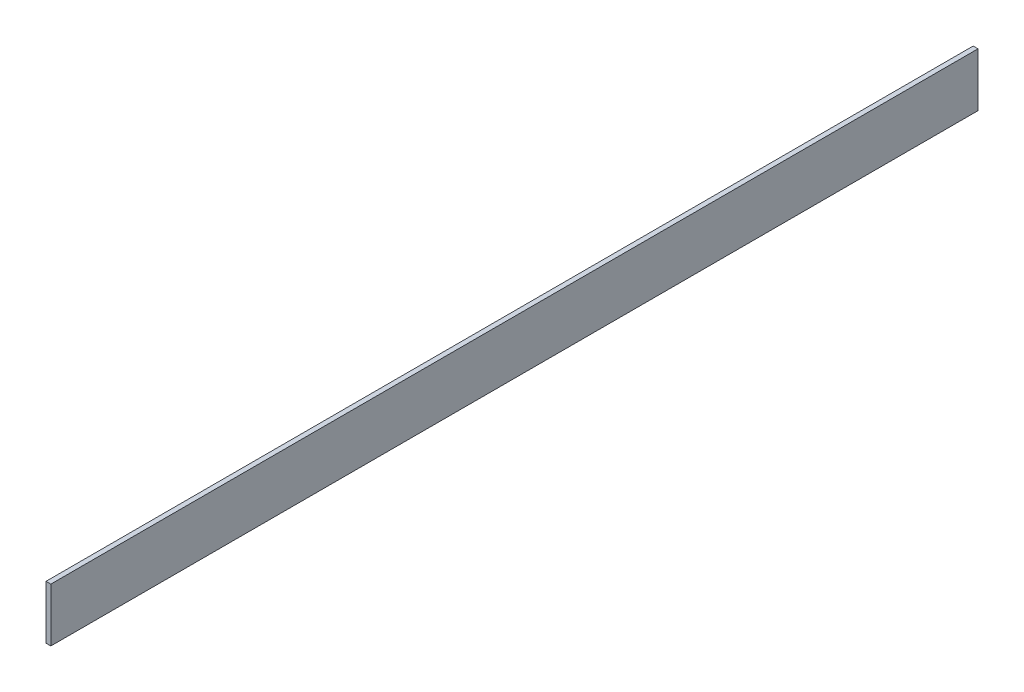
ISO-10303-21;
HEADER;
FILE_DESCRIPTION(('STEP AP214'),'2;1');
FILE_NAME('part.step','',(''),(''),'','','');
FILE_SCHEMA(('AUTOMOTIVE_DESIGN { 1 0 10303 214 1 1 1 1 }'));
ENDSEC;
DATA;
#1=APPLICATION_CONTEXT('core data for automotive mechanical design processes');
#2=APPLICATION_PROTOCOL_DEFINITION('international standard','automotive_design',2000,#1);
#3=PRODUCT_CONTEXT('',#1,'mechanical');
#4=PRODUCT('Part','Part','',(#3));
#5=PRODUCT_RELATED_PRODUCT_CATEGORY('part','',(#4));
#6=PRODUCT_DEFINITION_FORMATION('','',#4);
#7=PRODUCT_DEFINITION_CONTEXT('part definition',#1,'design');
#8=PRODUCT_DEFINITION('design','',#6,#7);
#9=PRODUCT_DEFINITION_SHAPE('','',#8);
#10=(LENGTH_UNIT() NAMED_UNIT(*) SI_UNIT(.MILLI.,.METRE.));
#11=(NAMED_UNIT(*) PLANE_ANGLE_UNIT() SI_UNIT($,.RADIAN.));
#12=(NAMED_UNIT(*) SI_UNIT($,.STERADIAN.) SOLID_ANGLE_UNIT());
#13=UNCERTAINTY_MEASURE_WITH_UNIT(LENGTH_MEASURE(1.E-05),#10,'distance_accuracy_value','');
#14=(GEOMETRIC_REPRESENTATION_CONTEXT(3) GLOBAL_UNCERTAINTY_ASSIGNED_CONTEXT((#13)) GLOBAL_UNIT_ASSIGNED_CONTEXT((#10,
#11,#12)) REPRESENTATION_CONTEXT('',''));
#15=CARTESIAN_POINT('',(0.,0.,0.));
#16=DIRECTION('',(0.,0.,1.));
#17=DIRECTION('',(1.,0.,0.));
#18=AXIS2_PLACEMENT_3D('',#15,#16,#17);
#19=CARTESIAN_POINT('',(6.35,0.,609.6));
#20=DIRECTION('',(0.,0.,-1.));
#21=DIRECTION('',(-1.,0.,0.));
#22=AXIS2_PLACEMENT_3D('',#19,#20,#21);
#23=PLANE('',#22);
#24=DIRECTION('',(0.,-1.,0.));
#25=VECTOR('',#24,1.);
#26=CARTESIAN_POINT('',(0.,0.,609.6));
#27=LINE('',#26,#25);
#28=CARTESIAN_POINT('',(0.,70.485,609.6));
#29=VERTEX_POINT('',#28);
#30=CARTESIAN_POINT('',(0.,0.,609.6));
#31=VERTEX_POINT('',#30);
#32=EDGE_CURVE('E97',#29,#31,#27,.T.);
#33=ORIENTED_EDGE('',*,*,#32,.T.);
#34=DIRECTION('',(-1.,0.,0.));
#35=VECTOR('',#34,1.);
#36=CARTESIAN_POINT('',(6.35,0.,609.6));
#37=LINE('',#36,#35);
#38=CARTESIAN_POINT('',(6.35,0.,609.6));
#39=VERTEX_POINT('',#38);
#40=EDGE_CURVE('E11',#39,#31,#37,.T.);
#41=ORIENTED_EDGE('',*,*,#40,.F.);
#42=DIRECTION('',(0.,-1.,0.));
#43=VECTOR('',#42,1.);
#44=CARTESIAN_POINT('',(6.35,0.,609.6));
#45=LINE('',#44,#43);
#46=CARTESIAN_POINT('',(6.35,70.485,609.6));
#47=VERTEX_POINT('',#46);
#48=EDGE_CURVE('E85',#47,#39,#45,.T.);
#49=ORIENTED_EDGE('',*,*,#48,.F.);
#50=DIRECTION('',(-1.,0.,0.));
#51=VECTOR('',#50,1.);
#52=CARTESIAN_POINT('',(6.35,70.485,609.6));
#53=LINE('',#52,#51);
#54=EDGE_CURVE('E93',#47,#29,#53,.T.);
#55=ORIENTED_EDGE('',*,*,#54,.T.);
#56=EDGE_LOOP('',(#33,#41,#49,#55));
#57=FACE_BOUND('',#56,.T.);
#58=ADVANCED_FACE('F34',(#57),#23,.F.);
#59=CARTESIAN_POINT('',(6.35,0.,609.6));
#60=DIRECTION('',(0.,1.,0.));
#61=DIRECTION('',(0.,0.,1.));
#62=AXIS2_PLACEMENT_3D('',#59,#60,#61);
#63=PLANE('',#62);
#64=DIRECTION('',(0.,0.,-1.));
#65=VECTOR('',#64,1.);
#66=CARTESIAN_POINT('',(0.,0.,609.6));
#67=LINE('',#66,#65);
#68=CARTESIAN_POINT('',(0.,0.,-609.6));
#69=VERTEX_POINT('',#68);
#70=EDGE_CURVE('E89',#31,#69,#67,.T.);
#71=ORIENTED_EDGE('',*,*,#70,.T.);
#72=DIRECTION('',(-1.,0.,0.));
#73=VECTOR('',#72,1.);
#74=CARTESIAN_POINT('',(6.35,0.,-609.6));
#75=LINE('',#74,#73);
#76=CARTESIAN_POINT('',(6.35,0.,-609.6));
#77=VERTEX_POINT('',#76);
#78=EDGE_CURVE('E42',#77,#69,#75,.T.);
#79=ORIENTED_EDGE('',*,*,#78,.F.);
#80=DIRECTION('',(0.,0.,-1.));
#81=VECTOR('',#80,1.);
#82=CARTESIAN_POINT('',(6.35,0.,609.6));
#83=LINE('',#82,#81);
#84=EDGE_CURVE('E80',#39,#77,#83,.T.);
#85=ORIENTED_EDGE('',*,*,#84,.F.);
#86=ORIENTED_EDGE('',*,*,#40,.T.);
#87=EDGE_LOOP('',(#71,#79,#85,#86));
#88=FACE_BOUND('',#87,.T.);
#89=ADVANCED_FACE('F88',(#88),#63,.F.);
#90=CARTESIAN_POINT('',(6.35,0.,-609.6));
#91=DIRECTION('',(0.,0.,1.));
#92=DIRECTION('',(1.,0.,0.));
#93=AXIS2_PLACEMENT_3D('',#90,#91,#92);
#94=PLANE('',#93);
#95=DIRECTION('',(0.,1.,0.));
#96=VECTOR('',#95,1.);
#97=CARTESIAN_POINT('',(0.,0.,-609.6));
#98=LINE('',#97,#96);
#99=CARTESIAN_POINT('',(0.,70.485,-609.6));
#100=VERTEX_POINT('',#99);
#101=EDGE_CURVE('E67',#69,#100,#98,.T.);
#102=ORIENTED_EDGE('',*,*,#101,.T.);
#103=DIRECTION('',(-1.,0.,0.));
#104=VECTOR('',#103,1.);
#105=CARTESIAN_POINT('',(6.35,70.485,-609.6));
#106=LINE('',#105,#104);
#107=CARTESIAN_POINT('',(6.35,70.485,-609.6));
#108=VERTEX_POINT('',#107);
#109=EDGE_CURVE('E90',#108,#100,#106,.T.);
#110=ORIENTED_EDGE('',*,*,#109,.F.);
#111=DIRECTION('',(0.,1.,0.));
#112=VECTOR('',#111,1.);
#113=CARTESIAN_POINT('',(6.35,0.,-609.6));
#114=LINE('',#113,#112);
#115=EDGE_CURVE('E83',#77,#108,#114,.T.);
#116=ORIENTED_EDGE('',*,*,#115,.F.);
#117=ORIENTED_EDGE('',*,*,#78,.T.);
#118=EDGE_LOOP('',(#102,#110,#116,#117));
#119=FACE_BOUND('',#118,.T.);
#120=ADVANCED_FACE('F91',(#119),#94,.F.);
#121=CARTESIAN_POINT('',(6.35,70.485,609.6));
#122=DIRECTION('',(0.,-1.,0.));
#123=DIRECTION('',(0.,0.,-1.));
#124=AXIS2_PLACEMENT_3D('',#121,#122,#123);
#125=PLANE('',#124);
#126=DIRECTION('',(0.,0.,1.));
#127=VECTOR('',#126,1.);
#128=CARTESIAN_POINT('',(0.,70.485,609.6));
#129=LINE('',#128,#127);
#130=EDGE_CURVE('E73',#100,#29,#129,.T.);
#131=ORIENTED_EDGE('',*,*,#130,.T.);
#132=ORIENTED_EDGE('',*,*,#54,.F.);
#133=DIRECTION('',(0.,0.,1.));
#134=VECTOR('',#133,1.);
#135=CARTESIAN_POINT('',(6.35,70.485,609.6));
#136=LINE('',#135,#134);
#137=EDGE_CURVE('E50',#108,#47,#136,.T.);
#138=ORIENTED_EDGE('',*,*,#137,.F.);
#139=ORIENTED_EDGE('',*,*,#109,.T.);
#140=EDGE_LOOP('',(#131,#132,#138,#139));
#141=FACE_BOUND('',#140,.T.);
#142=ADVANCED_FACE('F104',(#141),#125,.F.);
#143=CARTESIAN_POINT('',(6.35,0.,0.));
#144=DIRECTION('',(-1.,0.,0.));
#145=DIRECTION('',(0.,0.,1.));
#146=AXIS2_PLACEMENT_3D('',#143,#144,#145);
#147=PLANE('',#146);
#148=ORIENTED_EDGE('',*,*,#48,.T.);
#149=ORIENTED_EDGE('',*,*,#84,.T.);
#150=ORIENTED_EDGE('',*,*,#115,.T.);
#151=ORIENTED_EDGE('',*,*,#137,.T.);
#152=EDGE_LOOP('',(#148,#149,#150,#151));
#153=FACE_BOUND('',#152,.T.);
#154=ADVANCED_FACE('F81',(#153),#147,.F.);
#155=CARTESIAN_POINT('',(0.,0.,0.));
#156=DIRECTION('',(-1.,0.,0.));
#157=DIRECTION('',(0.,0.,1.));
#158=AXIS2_PLACEMENT_3D('',#155,#156,#157);
#159=PLANE('',#158);
#160=ORIENTED_EDGE('',*,*,#32,.F.);
#161=ORIENTED_EDGE('',*,*,#130,.F.);
#162=ORIENTED_EDGE('',*,*,#101,.F.);
#163=ORIENTED_EDGE('',*,*,#70,.F.);
#164=EDGE_LOOP('',(#160,#161,#162,#163));
#165=FACE_BOUND('',#164,.T.);
#166=ADVANCED_FACE('F107',(#165),#159,.T.);
#167=CLOSED_SHELL('',(#58,#89,#120,#142,#154,#166));
#168=MANIFOLD_SOLID_BREP('B2',#167);
#169=ADVANCED_BREP_SHAPE_REPRESENTATION('',(#18,#168),#14);
#170=SHAPE_DEFINITION_REPRESENTATION(#9,#169);
ENDSEC;
END-ISO-10303-21;
